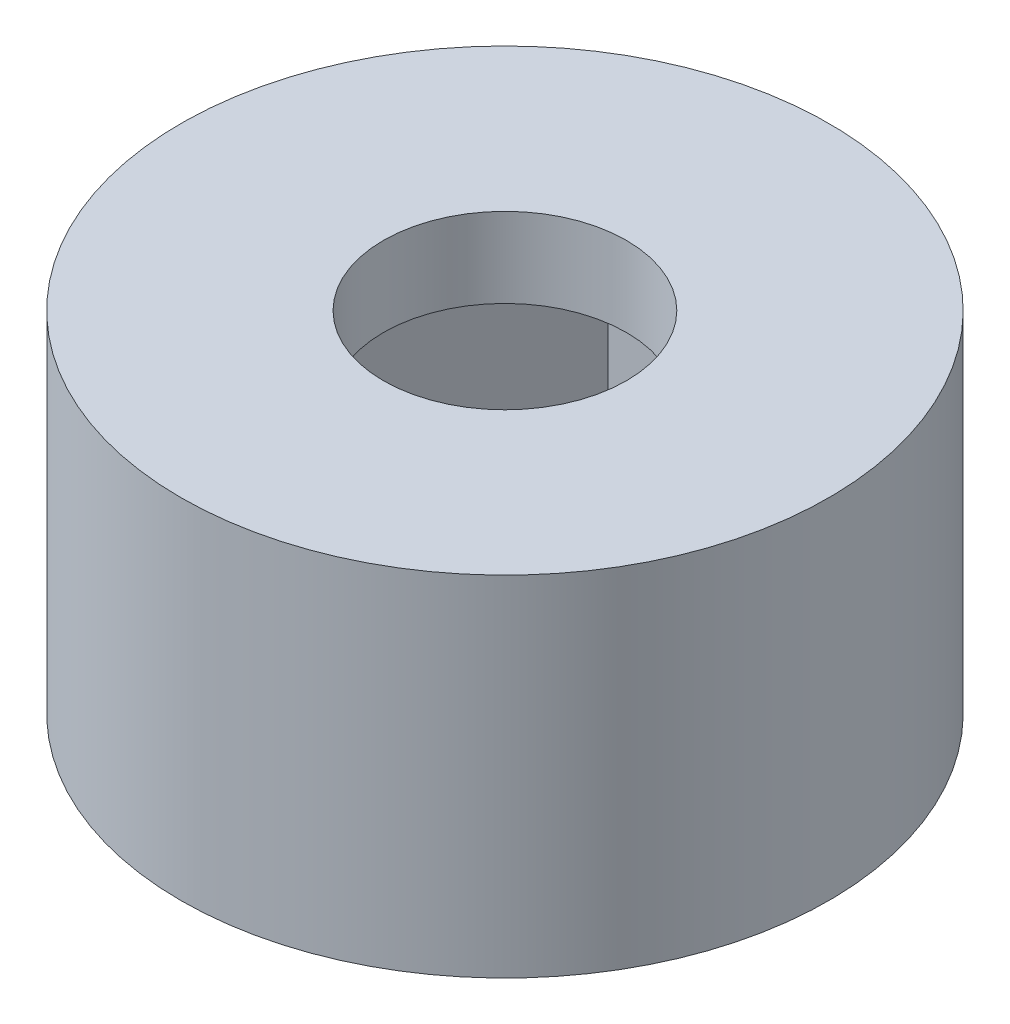
ISO-10303-21;
HEADER;
FILE_DESCRIPTION(('STEP AP214'),'2;1');
FILE_NAME('part.step','',(''),(''),'','','');
FILE_SCHEMA(('AUTOMOTIVE_DESIGN { 1 0 10303 214 1 1 1 1 }'));
ENDSEC;
DATA;
#1=APPLICATION_CONTEXT('core data for automotive mechanical design processes');
#2=APPLICATION_PROTOCOL_DEFINITION('international standard','automotive_design',2000,#1);
#3=PRODUCT_CONTEXT('',#1,'mechanical');
#4=PRODUCT('Part','Part','',(#3));
#5=PRODUCT_RELATED_PRODUCT_CATEGORY('part','',(#4));
#6=PRODUCT_DEFINITION_FORMATION('','',#4);
#7=PRODUCT_DEFINITION_CONTEXT('part definition',#1,'design');
#8=PRODUCT_DEFINITION('design','',#6,#7);
#9=PRODUCT_DEFINITION_SHAPE('','',#8);
#10=(LENGTH_UNIT() NAMED_UNIT(*) SI_UNIT(.MILLI.,.METRE.));
#11=(NAMED_UNIT(*) PLANE_ANGLE_UNIT() SI_UNIT($,.RADIAN.));
#12=(NAMED_UNIT(*) SI_UNIT($,.STERADIAN.) SOLID_ANGLE_UNIT());
#13=UNCERTAINTY_MEASURE_WITH_UNIT(LENGTH_MEASURE(1.E-05),#10,'distance_accuracy_value','');
#14=(GEOMETRIC_REPRESENTATION_CONTEXT(3) GLOBAL_UNCERTAINTY_ASSIGNED_CONTEXT((#13)) GLOBAL_UNIT_ASSIGNED_CONTEXT((#10,
#11,#12)) REPRESENTATION_CONTEXT('',''));
#15=CARTESIAN_POINT('',(0.,0.,0.));
#16=DIRECTION('',(0.,0.,1.));
#17=DIRECTION('',(1.,0.,0.));
#18=AXIS2_PLACEMENT_3D('',#15,#16,#17);
#19=CARTESIAN_POINT('',(1.41450815951458,-0.95,2.45));
#20=DIRECTION('',(0.866025403784439,0.,0.5));
#21=DIRECTION('',(0.5,0.,-0.866025403784439));
#22=AXIS2_PLACEMENT_3D('',#19,#20,#21);
#23=PLANE('',#22);
#24=DIRECTION('',(0.5,0.,-0.866025403784439));
#25=VECTOR('',#24,1.);
#26=CARTESIAN_POINT('',(1.41450815951458,0.95,2.45));
#27=LINE('',#26,#25);
#28=CARTESIAN_POINT('',(1.41450815951458,0.95,2.45));
#29=VERTEX_POINT('',#28);
#30=CARTESIAN_POINT('',(2.82901631902916,0.95,0.));
#31=VERTEX_POINT('',#30);
#32=EDGE_CURVE('E122',#29,#31,#27,.T.);
#33=ORIENTED_EDGE('',*,*,#32,.T.);
#34=DIRECTION('',(0.,1.,0.));
#35=VECTOR('',#34,1.);
#36=CARTESIAN_POINT('',(2.82901631902916,-0.95,0.));
#37=LINE('',#36,#35);
#38=CARTESIAN_POINT('',(2.82901631902916,-0.95,0.));
#39=VERTEX_POINT('',#38);
#40=EDGE_CURVE('E81',#39,#31,#37,.T.);
#41=ORIENTED_EDGE('',*,*,#40,.F.);
#42=DIRECTION('',(0.5,0.,-0.866025403784439));
#43=VECTOR('',#42,1.);
#44=CARTESIAN_POINT('',(1.41450815951458,-0.95,2.45));
#45=LINE('',#44,#43);
#46=CARTESIAN_POINT('',(1.41450815951458,-0.95,2.45));
#47=VERTEX_POINT('',#46);
#48=EDGE_CURVE('E136',#47,#39,#45,.T.);
#49=ORIENTED_EDGE('',*,*,#48,.F.);
#50=DIRECTION('',(0.,1.,0.));
#51=VECTOR('',#50,1.);
#52=CARTESIAN_POINT('',(1.41450815951458,-0.95,2.45));
#53=LINE('',#52,#51);
#54=EDGE_CURVE('E52',#47,#29,#53,.T.);
#55=ORIENTED_EDGE('',*,*,#54,.T.);
#56=EDGE_LOOP('',(#33,#41,#49,#55));
#57=FACE_BOUND('',#56,.T.);
#58=ADVANCED_FACE('F33',(#57),#23,.F.);
#59=CARTESIAN_POINT('',(-1.41450815951459,-0.95,2.45));
#60=DIRECTION('',(0.,0.,1.));
#61=DIRECTION('',(1.,0.,0.));
#62=AXIS2_PLACEMENT_3D('',#59,#60,#61);
#63=PLANE('',#62);
#64=DIRECTION('',(1.,0.,0.));
#65=VECTOR('',#64,1.);
#66=CARTESIAN_POINT('',(-1.41450815951459,0.95,2.45));
#67=LINE('',#66,#65);
#68=CARTESIAN_POINT('',(-1.41450815951459,0.95,2.45));
#69=VERTEX_POINT('',#68);
#70=EDGE_CURVE('E134',#69,#29,#67,.T.);
#71=ORIENTED_EDGE('',*,*,#70,.T.);
#72=ORIENTED_EDGE('',*,*,#54,.F.);
#73=DIRECTION('',(1.,0.,0.));
#74=VECTOR('',#73,1.);
#75=CARTESIAN_POINT('',(-1.41450815951459,-0.95,2.45));
#76=LINE('',#75,#74);
#77=CARTESIAN_POINT('',(-1.41450815951459,-0.95,2.45));
#78=VERTEX_POINT('',#77);
#79=EDGE_CURVE('E109',#78,#47,#76,.T.);
#80=ORIENTED_EDGE('',*,*,#79,.F.);
#81=DIRECTION('',(0.,1.,0.));
#82=VECTOR('',#81,1.);
#83=CARTESIAN_POINT('',(-1.41450815951459,-0.95,2.45));
#84=LINE('',#83,#82);
#85=EDGE_CURVE('E72',#78,#69,#84,.T.);
#86=ORIENTED_EDGE('',*,*,#85,.T.);
#87=EDGE_LOOP('',(#71,#72,#80,#86));
#88=FACE_BOUND('',#87,.T.);
#89=ADVANCED_FACE('F157',(#88),#63,.F.);
#90=CARTESIAN_POINT('',(-2.82901631902918,-0.95,0.));
#91=DIRECTION('',(-0.866025403784438,0.,0.500000000000001));
#92=DIRECTION('',(0.500000000000001,0.,0.866025403784438));
#93=AXIS2_PLACEMENT_3D('',#90,#91,#92);
#94=PLANE('',#93);
#95=DIRECTION('',(0.500000000000001,0.,0.866025403784438));
#96=VECTOR('',#95,1.);
#97=CARTESIAN_POINT('',(-2.82901631902918,0.95,0.));
#98=LINE('',#97,#96);
#99=CARTESIAN_POINT('',(-2.82901631902918,0.95,0.));
#100=VERTEX_POINT('',#99);
#101=EDGE_CURVE('E132',#100,#69,#98,.T.);
#102=ORIENTED_EDGE('',*,*,#101,.T.);
#103=ORIENTED_EDGE('',*,*,#85,.F.);
#104=DIRECTION('',(0.500000000000001,0.,0.866025403784438));
#105=VECTOR('',#104,1.);
#106=CARTESIAN_POINT('',(-2.82901631902918,-0.95,0.));
#107=LINE('',#106,#105);
#108=CARTESIAN_POINT('',(-2.82901631902918,-0.95,0.));
#109=VERTEX_POINT('',#108);
#110=EDGE_CURVE('E105',#109,#78,#107,.T.);
#111=ORIENTED_EDGE('',*,*,#110,.F.);
#112=DIRECTION('',(0.,1.,0.));
#113=VECTOR('',#112,1.);
#114=CARTESIAN_POINT('',(-2.82901631902918,-0.95,0.));
#115=LINE('',#114,#113);
#116=EDGE_CURVE('E92',#109,#100,#115,.T.);
#117=ORIENTED_EDGE('',*,*,#116,.T.);
#118=EDGE_LOOP('',(#102,#103,#111,#117));
#119=FACE_BOUND('',#118,.T.);
#120=ADVANCED_FACE('F106',(#119),#94,.F.);
#121=CARTESIAN_POINT('',(-1.41450815951459,-0.95,-2.45000000000001));
#122=DIRECTION('',(-0.866025403784439,0.,-0.5));
#123=DIRECTION('',(-0.5,0.,0.866025403784439));
#124=AXIS2_PLACEMENT_3D('',#121,#122,#123);
#125=PLANE('',#124);
#126=DIRECTION('',(-0.5,0.,0.866025403784439));
#127=VECTOR('',#126,1.);
#128=CARTESIAN_POINT('',(-1.41450815951459,0.95,-2.45000000000001));
#129=LINE('',#128,#127);
#130=CARTESIAN_POINT('',(-1.41450815951459,0.95,-2.45000000000001));
#131=VERTEX_POINT('',#130);
#132=EDGE_CURVE('E99',#131,#100,#129,.T.);
#133=ORIENTED_EDGE('',*,*,#132,.T.);
#134=ORIENTED_EDGE('',*,*,#116,.F.);
#135=DIRECTION('',(-0.5,0.,0.866025403784439));
#136=VECTOR('',#135,1.);
#137=CARTESIAN_POINT('',(-1.41450815951459,-0.95,-2.45000000000001));
#138=LINE('',#137,#136);
#139=CARTESIAN_POINT('',(-1.41450815951459,-0.95,-2.45000000000001));
#140=VERTEX_POINT('',#139);
#141=EDGE_CURVE('E96',#140,#109,#138,.T.);
#142=ORIENTED_EDGE('',*,*,#141,.F.);
#143=DIRECTION('',(0.,1.,0.));
#144=VECTOR('',#143,1.);
#145=CARTESIAN_POINT('',(-1.41450815951459,-0.95,-2.45000000000001));
#146=LINE('',#145,#144);
#147=EDGE_CURVE('E102',#140,#131,#146,.T.);
#148=ORIENTED_EDGE('',*,*,#147,.T.);
#149=EDGE_LOOP('',(#133,#134,#142,#148));
#150=FACE_BOUND('',#149,.T.);
#151=ADVANCED_FACE('F94',(#150),#125,.F.);
#152=CARTESIAN_POINT('',(1.41450815951458,-0.95,-2.45000000000001));
#153=DIRECTION('',(0.,0.,-1.));
#154=DIRECTION('',(-1.,0.,0.));
#155=AXIS2_PLACEMENT_3D('',#152,#153,#154);
#156=PLANE('',#155);
#157=DIRECTION('',(-1.,0.,0.));
#158=VECTOR('',#157,1.);
#159=CARTESIAN_POINT('',(1.41450815951458,0.95,-2.45000000000001));
#160=LINE('',#159,#158);
#161=CARTESIAN_POINT('',(1.41450815951458,0.95,-2.45000000000001));
#162=VERTEX_POINT('',#161);
#163=EDGE_CURVE('E128',#162,#131,#160,.T.);
#164=ORIENTED_EDGE('',*,*,#163,.T.);
#165=ORIENTED_EDGE('',*,*,#147,.F.);
#166=DIRECTION('',(-1.,0.,0.));
#167=VECTOR('',#166,1.);
#168=CARTESIAN_POINT('',(1.41450815951458,-0.95,-2.45000000000001));
#169=LINE('',#168,#167);
#170=CARTESIAN_POINT('',(1.41450815951458,-0.95,-2.45000000000001));
#171=VERTEX_POINT('',#170);
#172=EDGE_CURVE('E115',#171,#140,#169,.T.);
#173=ORIENTED_EDGE('',*,*,#172,.F.);
#174=DIRECTION('',(0.,1.,0.));
#175=VECTOR('',#174,1.);
#176=CARTESIAN_POINT('',(1.41450815951458,-0.95,-2.45000000000001));
#177=LINE('',#176,#175);
#178=EDGE_CURVE('E140',#171,#162,#177,.T.);
#179=ORIENTED_EDGE('',*,*,#178,.T.);
#180=EDGE_LOOP('',(#164,#165,#173,#179));
#181=FACE_BOUND('',#180,.T.);
#182=ADVANCED_FACE('F167',(#181),#156,.F.);
#183=CARTESIAN_POINT('',(2.82901631902916,-0.95,0.));
#184=DIRECTION('',(0.866025403784439,0.,-0.499999999999999));
#185=DIRECTION('',(-0.5,0.,-0.866025403784439));
#186=AXIS2_PLACEMENT_3D('',#183,#184,#185);
#187=PLANE('',#186);
#188=DIRECTION('',(-0.5,0.,-0.866025403784439));
#189=VECTOR('',#188,1.);
#190=CARTESIAN_POINT('',(2.82901631902916,0.95,0.));
#191=LINE('',#190,#189);
#192=EDGE_CURVE('E124',#31,#162,#191,.T.);
#193=ORIENTED_EDGE('',*,*,#192,.T.);
#194=ORIENTED_EDGE('',*,*,#178,.F.);
#195=DIRECTION('',(-0.5,0.,-0.866025403784439));
#196=VECTOR('',#195,1.);
#197=CARTESIAN_POINT('',(2.82901631902916,-0.95,0.));
#198=LINE('',#197,#196);
#199=EDGE_CURVE('E117',#39,#171,#198,.T.);
#200=ORIENTED_EDGE('',*,*,#199,.F.);
#201=ORIENTED_EDGE('',*,*,#40,.T.);
#202=EDGE_LOOP('',(#193,#194,#200,#201));
#203=FACE_BOUND('',#202,.T.);
#204=ADVANCED_FACE('F164',(#203),#187,.F.);
#205=CARTESIAN_POINT('',(0.,-0.95,0.));
#206=DIRECTION('',(0.,1.,0.));
#207=DIRECTION('',(0.,0.,1.));
#208=AXIS2_PLACEMENT_3D('',#205,#206,#207);
#209=PLANE('',#208);
#210=CARTESIAN_POINT('',(0.,-0.95,0.));
#211=DIRECTION('',(0.,1.,0.));
#212=DIRECTION('',(0.,0.,1.));
#213=AXIS2_PLACEMENT_3D('',#210,#211,#212);
#214=CIRCLE('',#213,1.2192);
#215=CARTESIAN_POINT('',(0.,-0.95,1.2192));
#216=VERTEX_POINT('',#215);
#217=EDGE_CURVE('E125',#216,#216,#214,.T.);
#218=ORIENTED_EDGE('',*,*,#217,.F.);
#219=EDGE_LOOP('',(#218));
#220=FACE_BOUND('',#219,.T.);
#221=ORIENTED_EDGE('',*,*,#48,.T.);
#222=ORIENTED_EDGE('',*,*,#199,.T.);
#223=ORIENTED_EDGE('',*,*,#172,.T.);
#224=ORIENTED_EDGE('',*,*,#141,.T.);
#225=ORIENTED_EDGE('',*,*,#110,.T.);
#226=ORIENTED_EDGE('',*,*,#79,.T.);
#227=EDGE_LOOP('',(#221,#222,#223,#224,#225,#226));
#228=FACE_BOUND('',#227,.T.);
#229=ADVANCED_FACE('F112',(#220,#228),#209,.T.);
#230=CARTESIAN_POINT('',(0.,0.95,0.));
#231=DIRECTION('',(0.,1.,0.));
#232=DIRECTION('',(0.,0.,1.));
#233=AXIS2_PLACEMENT_3D('',#230,#231,#232);
#234=PLANE('',#233);
#235=CARTESIAN_POINT('',(0.,0.95,0.));
#236=DIRECTION('',(0.,1.,0.));
#237=DIRECTION('',(0.,0.,1.));
#238=AXIS2_PLACEMENT_3D('',#235,#236,#237);
#239=CIRCLE('',#238,1.2192);
#240=CARTESIAN_POINT('',(0.,0.95,1.2192));
#241=VERTEX_POINT('',#240);
#242=EDGE_CURVE('E37',#241,#241,#239,.T.);
#243=ORIENTED_EDGE('',*,*,#242,.T.);
#244=EDGE_LOOP('',(#243));
#245=FACE_BOUND('',#244,.T.);
#246=ORIENTED_EDGE('',*,*,#32,.F.);
#247=ORIENTED_EDGE('',*,*,#70,.F.);
#248=ORIENTED_EDGE('',*,*,#101,.F.);
#249=ORIENTED_EDGE('',*,*,#132,.F.);
#250=ORIENTED_EDGE('',*,*,#163,.F.);
#251=ORIENTED_EDGE('',*,*,#192,.F.);
#252=EDGE_LOOP('',(#246,#247,#248,#249,#250,#251));
#253=FACE_BOUND('',#252,.T.);
#254=ADVANCED_FACE('F176',(#245,#253),#234,.F.);
#255=CARTESIAN_POINT('',(0.,1.75,0.));
#256=DIRECTION('',(0.,1.,0.));
#257=DIRECTION('',(0.,0.,1.));
#258=AXIS2_PLACEMENT_3D('',#255,#256,#257);
#259=CYLINDRICAL_SURFACE('',#258,1.2192);
#260=CARTESIAN_POINT('',(0.,1.75,0.));
#261=DIRECTION('',(0.,1.,0.));
#262=DIRECTION('',(0.,0.,1.));
#263=AXIS2_PLACEMENT_3D('',#260,#261,#262);
#264=CIRCLE('',#263,1.2192);
#265=CARTESIAN_POINT('',(0.,1.75,1.2192));
#266=VERTEX_POINT('',#265);
#267=EDGE_CURVE('E198',#266,#266,#264,.T.);
#268=ORIENTED_EDGE('',*,*,#267,.T.);
#269=EDGE_LOOP('',(#268));
#270=FACE_BOUND('',#269,.T.);
#271=ORIENTED_EDGE('',*,*,#242,.F.);
#272=EDGE_LOOP('',(#271));
#273=FACE_BOUND('',#272,.T.);
#274=ADVANCED_FACE('F179',(#270,#273),#259,.F.);
#275=ORIENTED_EDGE('',*,*,#217,.T.);
#276=EDGE_LOOP('',(#275));
#277=FACE_BOUND('',#276,.T.);
#278=CARTESIAN_POINT('',(0.,-1.75,0.));
#279=DIRECTION('',(0.,1.,0.));
#280=DIRECTION('',(0.,0.,1.));
#281=AXIS2_PLACEMENT_3D('',#278,#279,#280);
#282=CIRCLE('',#281,1.2192);
#283=CARTESIAN_POINT('',(0.,-1.75,1.2192));
#284=VERTEX_POINT('',#283);
#285=EDGE_CURVE('E197',#284,#284,#282,.T.);
#286=ORIENTED_EDGE('',*,*,#285,.F.);
#287=EDGE_LOOP('',(#286));
#288=FACE_BOUND('',#287,.T.);
#289=ADVANCED_FACE('F184',(#277,#288),#259,.F.);
#290=CARTESIAN_POINT('',(0.,1.75,0.));
#291=DIRECTION('',(0.,-1.,0.));
#292=DIRECTION('',(0.,0.,-1.));
#293=AXIS2_PLACEMENT_3D('',#290,#291,#292);
#294=CYLINDRICAL_SURFACE('',#293,3.25);
#295=CARTESIAN_POINT('',(0.,1.75,0.));
#296=DIRECTION('',(0.,1.,0.));
#297=DIRECTION('',(0.,0.,1.));
#298=AXIS2_PLACEMENT_3D('',#295,#296,#297);
#299=CIRCLE('',#298,3.25);
#300=CARTESIAN_POINT('',(0.,1.75,3.25));
#301=VERTEX_POINT('',#300);
#302=EDGE_CURVE('E11',#301,#301,#299,.T.);
#303=ORIENTED_EDGE('',*,*,#302,.F.);
#304=EDGE_LOOP('',(#303));
#305=FACE_BOUND('',#304,.T.);
#306=CARTESIAN_POINT('',(0.,-1.75,0.));
#307=DIRECTION('',(0.,1.,0.));
#308=DIRECTION('',(0.,0.,1.));
#309=AXIS2_PLACEMENT_3D('',#306,#307,#308);
#310=CIRCLE('',#309,3.25);
#311=CARTESIAN_POINT('',(0.,-1.75,3.25));
#312=VERTEX_POINT('',#311);
#313=EDGE_CURVE('E43',#312,#312,#310,.T.);
#314=ORIENTED_EDGE('',*,*,#313,.T.);
#315=EDGE_LOOP('',(#314));
#316=FACE_BOUND('',#315,.T.);
#317=ADVANCED_FACE('F35',(#305,#316),#294,.T.);
#318=CARTESIAN_POINT('',(0.,1.75,0.));
#319=DIRECTION('',(0.,1.,0.));
#320=DIRECTION('',(0.,0.,1.));
#321=AXIS2_PLACEMENT_3D('',#318,#319,#320);
#322=PLANE('',#321);
#323=ORIENTED_EDGE('',*,*,#267,.F.);
#324=EDGE_LOOP('',(#323));
#325=FACE_BOUND('',#324,.T.);
#326=ORIENTED_EDGE('',*,*,#302,.T.);
#327=EDGE_LOOP('',(#326));
#328=FACE_BOUND('',#327,.T.);
#329=ADVANCED_FACE('F148',(#325,#328),#322,.T.);
#330=CARTESIAN_POINT('',(0.,-1.75,0.));
#331=DIRECTION('',(0.,1.,0.));
#332=DIRECTION('',(0.,0.,1.));
#333=AXIS2_PLACEMENT_3D('',#330,#331,#332);
#334=PLANE('',#333);
#335=ORIENTED_EDGE('',*,*,#285,.T.);
#336=EDGE_LOOP('',(#335));
#337=FACE_BOUND('',#336,.T.);
#338=ORIENTED_EDGE('',*,*,#313,.F.);
#339=EDGE_LOOP('',(#338));
#340=FACE_BOUND('',#339,.T.);
#341=ADVANCED_FACE('F146',(#337,#340),#334,.F.);
#342=CLOSED_SHELL('',(#58,#89,#120,#151,#182,#204,#229,#254,#274,#289,#317,#329,#341));
#343=MANIFOLD_SOLID_BREP('B2',#342);
#344=ADVANCED_BREP_SHAPE_REPRESENTATION('',(#18,#343),#14);
#345=SHAPE_DEFINITION_REPRESENTATION(#9,#344);
ENDSEC;
END-ISO-10303-21;
